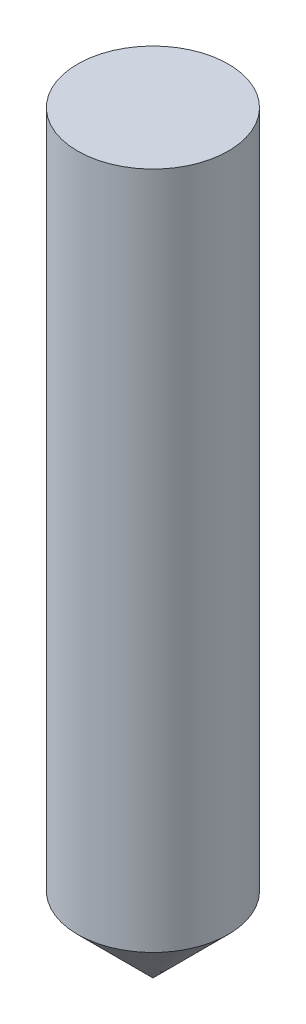
ISO-10303-21;
HEADER;
FILE_DESCRIPTION(('STEP AP214'),'2;1');
FILE_NAME('part.step','',(''),(''),'','','');
FILE_SCHEMA(('AUTOMOTIVE_DESIGN { 1 0 10303 214 1 1 1 1 }'));
ENDSEC;
DATA;
#1=APPLICATION_CONTEXT('core data for automotive mechanical design processes');
#2=APPLICATION_PROTOCOL_DEFINITION('international standard','automotive_design',2000,#1);
#3=PRODUCT_CONTEXT('',#1,'mechanical');
#4=PRODUCT('Part','Part','',(#3));
#5=PRODUCT_RELATED_PRODUCT_CATEGORY('part','',(#4));
#6=PRODUCT_DEFINITION_FORMATION('','',#4);
#7=PRODUCT_DEFINITION_CONTEXT('part definition',#1,'design');
#8=PRODUCT_DEFINITION('design','',#6,#7);
#9=PRODUCT_DEFINITION_SHAPE('','',#8);
#10=(LENGTH_UNIT() NAMED_UNIT(*) SI_UNIT(.MILLI.,.METRE.));
#11=(NAMED_UNIT(*) PLANE_ANGLE_UNIT() SI_UNIT($,.RADIAN.));
#12=(NAMED_UNIT(*) SI_UNIT($,.STERADIAN.) SOLID_ANGLE_UNIT());
#13=UNCERTAINTY_MEASURE_WITH_UNIT(LENGTH_MEASURE(1.E-05),#10,'distance_accuracy_value','');
#14=(GEOMETRIC_REPRESENTATION_CONTEXT(3) GLOBAL_UNCERTAINTY_ASSIGNED_CONTEXT((#13)) GLOBAL_UNIT_ASSIGNED_CONTEXT((#10,
#11,#12)) REPRESENTATION_CONTEXT('',''));
#15=CARTESIAN_POINT('',(0.,0.,0.));
#16=DIRECTION('',(0.,0.,1.));
#17=DIRECTION('',(1.,0.,0.));
#18=AXIS2_PLACEMENT_3D('',#15,#16,#17);
#19=CARTESIAN_POINT('',(0.,50.,0.));
#20=DIRECTION('',(0.,-1.,0.));
#21=DIRECTION('',(0.,0.,-1.));
#22=AXIS2_PLACEMENT_3D('',#19,#20,#21);
#23=CYLINDRICAL_SURFACE('',#22,5.);
#24=CARTESIAN_POINT('',(0.,5.00000000000001,0.));
#25=DIRECTION('',(0.,1.,0.));
#26=DIRECTION('',(0.,0.,1.));
#27=AXIS2_PLACEMENT_3D('',#24,#25,#26);
#28=CIRCLE('',#27,5.);
#29=CARTESIAN_POINT('',(0.,5.00000000000001,5.));
#30=VERTEX_POINT('',#29);
#31=EDGE_CURVE('E11',#30,#30,#28,.T.);
#32=ORIENTED_EDGE('',*,*,#31,.T.);
#33=EDGE_LOOP('',(#32));
#34=FACE_BOUND('',#33,.T.);
#35=CARTESIAN_POINT('',(0.,50.,0.));
#36=DIRECTION('',(0.,1.,0.));
#37=DIRECTION('',(0.,0.,1.));
#38=AXIS2_PLACEMENT_3D('',#35,#36,#37);
#39=CIRCLE('',#38,5.);
#40=CARTESIAN_POINT('',(0.,50.,5.));
#41=VERTEX_POINT('',#40);
#42=EDGE_CURVE('E52',#41,#41,#39,.T.);
#43=ORIENTED_EDGE('',*,*,#42,.F.);
#44=EDGE_LOOP('',(#43));
#45=FACE_BOUND('',#44,.T.);
#46=ADVANCED_FACE('F43',(#34,#45),#23,.T.);
#47=CARTESIAN_POINT('',(0.,50.,0.));
#48=DIRECTION('',(0.,1.,0.));
#49=DIRECTION('',(0.,0.,1.));
#50=AXIS2_PLACEMENT_3D('',#47,#48,#49);
#51=PLANE('',#50);
#52=ORIENTED_EDGE('',*,*,#42,.T.);
#53=EDGE_LOOP('',(#52));
#54=FACE_BOUND('',#53,.T.);
#55=ADVANCED_FACE('F57',(#54),#51,.T.);
#56=CARTESIAN_POINT('',(0.,5.00000000000001,0.));
#57=DIRECTION('',(0.,1.,0.));
#58=DIRECTION('',(0.,0.,1.));
#59=AXIS2_PLACEMENT_3D('',#56,#57,#58);
#60=CONICAL_SURFACE('',#59,5.00000000000003,0.78539816339745);
#61=CARTESIAN_POINT('',(0.,0.,0.));
#62=VERTEX_POINT('',#61);
#63=VERTEX_LOOP('',#62);
#64=FACE_BOUND('',#63,.T.);
#65=ORIENTED_EDGE('',*,*,#31,.F.);
#66=EDGE_LOOP('',(#65));
#67=FACE_BOUND('',#66,.T.);
#68=ADVANCED_FACE('F46',(#64,#67),#60,.T.);
#69=CLOSED_SHELL('',(#46,#55,#68));
#70=MANIFOLD_SOLID_BREP('B2',#69);
#71=ADVANCED_BREP_SHAPE_REPRESENTATION('',(#18,#70),#14);
#72=SHAPE_DEFINITION_REPRESENTATION(#9,#71);
ENDSEC;
END-ISO-10303-21;
